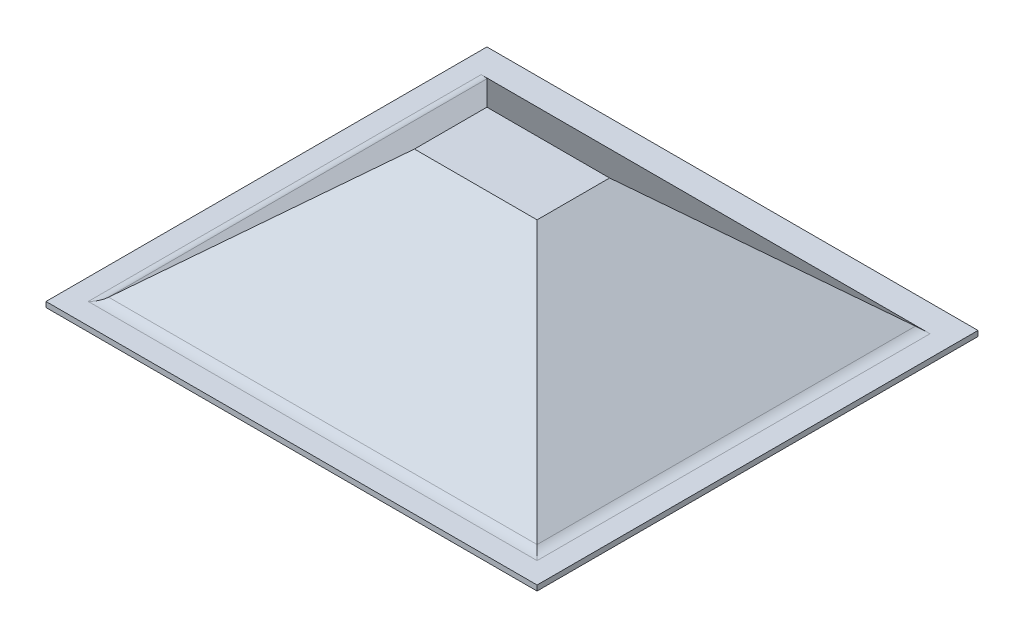
ISO-10303-21;
HEADER;
FILE_DESCRIPTION(('STEP AP214'),'2;1');
FILE_NAME('part.step','',(''),(''),'','','');
FILE_SCHEMA(('AUTOMOTIVE_DESIGN { 1 0 10303 214 1 1 1 1 }'));
ENDSEC;
DATA;
#1=APPLICATION_CONTEXT('core data for automotive mechanical design processes');
#2=APPLICATION_PROTOCOL_DEFINITION('international standard','automotive_design',2000,#1);
#3=PRODUCT_CONTEXT('',#1,'mechanical');
#4=PRODUCT('Part','Part','',(#3));
#5=PRODUCT_RELATED_PRODUCT_CATEGORY('part','',(#4));
#6=PRODUCT_DEFINITION_FORMATION('','',#4);
#7=PRODUCT_DEFINITION_CONTEXT('part definition',#1,'design');
#8=PRODUCT_DEFINITION('design','',#6,#7);
#9=PRODUCT_DEFINITION_SHAPE('','',#8);
#10=(LENGTH_UNIT() NAMED_UNIT(*) SI_UNIT(.MILLI.,.METRE.));
#11=(NAMED_UNIT(*) PLANE_ANGLE_UNIT() SI_UNIT($,.RADIAN.));
#12=(NAMED_UNIT(*) SI_UNIT($,.STERADIAN.) SOLID_ANGLE_UNIT());
#13=UNCERTAINTY_MEASURE_WITH_UNIT(LENGTH_MEASURE(1.E-05),#10,'distance_accuracy_value','');
#14=(GEOMETRIC_REPRESENTATION_CONTEXT(3) GLOBAL_UNCERTAINTY_ASSIGNED_CONTEXT((#13)) GLOBAL_UNIT_ASSIGNED_CONTEXT((#10,
#11,#12)) REPRESENTATION_CONTEXT('',''));
#15=CARTESIAN_POINT('',(0.,0.,0.));
#16=DIRECTION('',(0.,0.,1.));
#17=DIRECTION('',(1.,0.,0.));
#18=AXIS2_PLACEMENT_3D('',#15,#16,#17);
#19=CARTESIAN_POINT('',(-79.,-32.,-79.5));
#20=DIRECTION('',(-1.,0.,0.));
#21=DIRECTION('',(0.,-1.,0.));
#22=AXIS2_PLACEMENT_3D('',#19,#20,#21);
#23=PLANE('',#22);
#24=DIRECTION('',(0.,0.,1.));
#25=VECTOR('',#24,1.);
#26=CARTESIAN_POINT('',(-78.9999999999999,-30.,-84.));
#27=LINE('',#26,#25);
#28=CARTESIAN_POINT('',(-79.,-30.,-79.5));
#29=VERTEX_POINT('',#28);
#30=CARTESIAN_POINT('',(-79.,-30.,79.5));
#31=VERTEX_POINT('',#30);
#32=EDGE_CURVE('E55',#29,#31,#27,.T.);
#33=ORIENTED_EDGE('',*,*,#32,.F.);
#34=DIRECTION('',(0.,-1.,0.));
#35=VECTOR('',#34,1.);
#36=CARTESIAN_POINT('',(-79.,-32.,-79.5));
#37=LINE('',#36,#35);
#38=CARTESIAN_POINT('',(-79.,-32.,-79.5));
#39=VERTEX_POINT('',#38);
#40=EDGE_CURVE('E47',#29,#39,#37,.T.);
#41=ORIENTED_EDGE('',*,*,#40,.T.);
#42=DIRECTION('',(0.,0.,1.));
#43=VECTOR('',#42,1.);
#44=CARTESIAN_POINT('',(-79.,-32.,87.5));
#45=LINE('',#44,#43);
#46=CARTESIAN_POINT('',(-79.,-32.,79.5));
#47=VERTEX_POINT('',#46);
#48=EDGE_CURVE('E42',#39,#47,#45,.T.);
#49=ORIENTED_EDGE('',*,*,#48,.T.);
#50=DIRECTION('',(0.,-1.,0.));
#51=VECTOR('',#50,1.);
#52=CARTESIAN_POINT('',(-79.,-32.,79.5));
#53=LINE('',#52,#51);
#54=EDGE_CURVE('E11',#31,#47,#53,.T.);
#55=ORIENTED_EDGE('',*,*,#54,.F.);
#56=EDGE_LOOP('',(#33,#41,#49,#55));
#57=FACE_BOUND('',#56,.T.);
#58=ADVANCED_FACE('F38',(#57),#23,.T.);
#59=CARTESIAN_POINT('',(99.,-32.,-79.5));
#60=DIRECTION('',(0.,0.,-1.));
#61=DIRECTION('',(-1.,0.,0.));
#62=AXIS2_PLACEMENT_3D('',#59,#60,#61);
#63=PLANE('',#62);
#64=DIRECTION('',(-1.,0.,0.));
#65=VECTOR('',#64,1.);
#66=CARTESIAN_POINT('',(103.5,-30.,-79.5));
#67=LINE('',#66,#65);
#68=CARTESIAN_POINT('',(99.,-30.,-79.5));
#69=VERTEX_POINT('',#68);
#70=EDGE_CURVE('E219',#69,#29,#67,.T.);
#71=ORIENTED_EDGE('',*,*,#70,.F.);
#72=DIRECTION('',(0.,-1.,0.));
#73=VECTOR('',#72,1.);
#74=CARTESIAN_POINT('',(99.,-32.,-79.5));
#75=LINE('',#74,#73);
#76=CARTESIAN_POINT('',(99.,-32.,-79.5));
#77=VERTEX_POINT('',#76);
#78=EDGE_CURVE('E308',#69,#77,#75,.T.);
#79=ORIENTED_EDGE('',*,*,#78,.T.);
#80=DIRECTION('',(-1.,0.,0.));
#81=VECTOR('',#80,1.);
#82=CARTESIAN_POINT('',(-125.,-32.,-79.5));
#83=LINE('',#82,#81);
#84=EDGE_CURVE('E262',#77,#39,#83,.T.);
#85=ORIENTED_EDGE('',*,*,#84,.T.);
#86=ORIENTED_EDGE('',*,*,#40,.F.);
#87=EDGE_LOOP('',(#71,#79,#85,#86));
#88=FACE_BOUND('',#87,.T.);
#89=ADVANCED_FACE('F389',(#88),#63,.T.);
#90=CARTESIAN_POINT('',(-79.,-32.,79.5));
#91=DIRECTION('',(0.,0.,1.));
#92=DIRECTION('',(1.,0.,0.));
#93=AXIS2_PLACEMENT_3D('',#90,#91,#92);
#94=PLANE('',#93);
#95=DIRECTION('',(1.,0.,0.));
#96=VECTOR('',#95,1.);
#97=CARTESIAN_POINT('',(-83.5,-30.,79.5));
#98=LINE('',#97,#96);
#99=CARTESIAN_POINT('',(99.,-30.,79.5));
#100=VERTEX_POINT('',#99);
#101=EDGE_CURVE('E62',#31,#100,#98,.T.);
#102=ORIENTED_EDGE('',*,*,#101,.F.);
#103=ORIENTED_EDGE('',*,*,#54,.T.);
#104=DIRECTION('',(1.,0.,0.));
#105=VECTOR('',#104,1.);
#106=CARTESIAN_POINT('',(-125.,-32.,79.5));
#107=LINE('',#106,#105);
#108=CARTESIAN_POINT('',(99.,-32.,79.5));
#109=VERTEX_POINT('',#108);
#110=EDGE_CURVE('E360',#47,#109,#107,.T.);
#111=ORIENTED_EDGE('',*,*,#110,.T.);
#112=DIRECTION('',(0.,-1.,0.));
#113=VECTOR('',#112,1.);
#114=CARTESIAN_POINT('',(99.,-32.,79.5));
#115=LINE('',#114,#113);
#116=EDGE_CURVE('E353',#100,#109,#115,.T.);
#117=ORIENTED_EDGE('',*,*,#116,.F.);
#118=EDGE_LOOP('',(#102,#103,#111,#117));
#119=FACE_BOUND('',#118,.T.);
#120=ADVANCED_FACE('F371',(#119),#94,.T.);
#121=CARTESIAN_POINT('',(99.,-32.,79.5));
#122=DIRECTION('',(1.,0.,0.));
#123=DIRECTION('',(0.,1.,0.));
#124=AXIS2_PLACEMENT_3D('',#121,#122,#123);
#125=PLANE('',#124);
#126=DIRECTION('',(0.,0.,-1.));
#127=VECTOR('',#126,1.);
#128=CARTESIAN_POINT('',(99.,-30.,84.));
#129=LINE('',#128,#127);
#130=EDGE_CURVE('E211',#100,#69,#129,.T.);
#131=ORIENTED_EDGE('',*,*,#130,.F.);
#132=ORIENTED_EDGE('',*,*,#116,.T.);
#133=DIRECTION('',(0.,0.,-1.));
#134=VECTOR('',#133,1.);
#135=CARTESIAN_POINT('',(99.,-32.,87.5));
#136=LINE('',#135,#134);
#137=EDGE_CURVE('E358',#109,#77,#136,.T.);
#138=ORIENTED_EDGE('',*,*,#137,.T.);
#139=ORIENTED_EDGE('',*,*,#78,.F.);
#140=EDGE_LOOP('',(#131,#132,#138,#139));
#141=FACE_BOUND('',#140,.T.);
#142=ADVANCED_FACE('F369',(#141),#125,.T.);
#143=CARTESIAN_POINT('',(-125.,-32.,87.5));
#144=DIRECTION('',(0.,1.,0.));
#145=DIRECTION('',(-1.,0.,0.));
#146=AXIS2_PLACEMENT_3D('',#143,#144,#145);
#147=PLANE('',#146);
#148=DIRECTION('',(-1.,0.,0.));
#149=VECTOR('',#148,1.);
#150=CARTESIAN_POINT('',(-125.,-32.,75.5));
#151=LINE('',#150,#149);
#152=CARTESIAN_POINT('',(-75.,-32.,75.5));
#153=VERTEX_POINT('',#152);
#154=CARTESIAN_POINT('',(95.,-32.,75.5));
#155=VERTEX_POINT('',#154);
#156=EDGE_CURVE('E272',#153,#155,#151,.F.);
#157=ORIENTED_EDGE('',*,*,#156,.T.);
#158=DIRECTION('',(0.,0.,1.));
#159=VECTOR('',#158,1.);
#160=CARTESIAN_POINT('',(95.,-32.,87.5));
#161=LINE('',#160,#159);
#162=CARTESIAN_POINT('',(95.,-32.,-75.5));
#163=VERTEX_POINT('',#162);
#164=EDGE_CURVE('E269',#155,#163,#161,.F.);
#165=ORIENTED_EDGE('',*,*,#164,.T.);
#166=DIRECTION('',(1.,0.,0.));
#167=VECTOR('',#166,1.);
#168=CARTESIAN_POINT('',(-125.,-32.,-75.5));
#169=LINE('',#168,#167);
#170=CARTESIAN_POINT('',(-75.,-32.,-75.5));
#171=VERTEX_POINT('',#170);
#172=EDGE_CURVE('E276',#163,#171,#169,.F.);
#173=ORIENTED_EDGE('',*,*,#172,.T.);
#174=DIRECTION('',(0.,0.,-1.));
#175=VECTOR('',#174,1.);
#176=CARTESIAN_POINT('',(-75.,-32.,87.5));
#177=LINE('',#176,#175);
#178=EDGE_CURVE('E274',#171,#153,#177,.F.);
#179=ORIENTED_EDGE('',*,*,#178,.T.);
#180=EDGE_LOOP('',(#157,#165,#173,#179));
#181=FACE_BOUND('',#180,.T.);
#182=ORIENTED_EDGE('',*,*,#84,.F.);
#183=ORIENTED_EDGE('',*,*,#137,.F.);
#184=ORIENTED_EDGE('',*,*,#110,.F.);
#185=ORIENTED_EDGE('',*,*,#48,.F.);
#186=EDGE_LOOP('',(#182,#183,#184,#185));
#187=FACE_BOUND('',#186,.T.);
#188=ADVANCED_FACE('F40',(#181,#187),#147,.F.);
#189=CARTESIAN_POINT('',(-68.5721239031346,-29.6604444311898,-75.5));
#190=DIRECTION('',(-0.642787609686538,0.766044443118979,0.));
#191=DIRECTION('',(-0.766044443118979,-0.642787609686538,0.));
#192=AXIS2_PLACEMENT_3D('',#189,#190,#191);
#193=PLANE('',#192);
#194=DIRECTION('',(-0.608120402411343,-0.510273605374736,0.608120402411343));
#195=VECTOR('',#194,1.);
#196=CARTESIAN_POINT('',(-70.9492194868363,-31.655064458747,71.4492194868363));
#197=LINE('',#196,#195);
#198=CARTESIAN_POINT('',(-11.7726180276272,18.,12.2726180276273));
#199=VERTEX_POINT('',#198);
#200=CARTESIAN_POINT('',(-68.5721239031346,-29.6604444311898,69.0721239031346));
#201=VERTEX_POINT('',#200);
#202=EDGE_CURVE('E278',#199,#201,#197,.T.);
#203=ORIENTED_EDGE('',*,*,#202,.T.);
#204=DIRECTION('',(0.,0.,-1.));
#205=VECTOR('',#204,1.);
#206=CARTESIAN_POINT('',(-68.5721239031346,-29.6604444311898,-75.5));
#207=LINE('',#206,#205);
#208=CARTESIAN_POINT('',(-68.5721239031346,-29.6604444311898,-69.0721239031346));
#209=VERTEX_POINT('',#208);
#210=EDGE_CURVE('E261',#201,#209,#207,.T.);
#211=ORIENTED_EDGE('',*,*,#210,.T.);
#212=DIRECTION('',(-0.608120402411343,-0.510273605374736,-0.608120402411344));
#213=VECTOR('',#212,1.);
#214=CARTESIAN_POINT('',(-70.9492194868363,-31.655064458747,-71.4492194868363));
#215=LINE('',#214,#213);
#216=CARTESIAN_POINT('',(-11.7726180276272,18.,-12.2726180276273));
#217=VERTEX_POINT('',#216);
#218=EDGE_CURVE('E286',#217,#209,#215,.T.);
#219=ORIENTED_EDGE('',*,*,#218,.F.);
#220=DIRECTION('',(0.,0.,-1.));
#221=VECTOR('',#220,1.);
#222=CARTESIAN_POINT('',(-11.7726180276272,18.,-75.5));
#223=LINE('',#222,#221);
#224=EDGE_CURVE('E251',#199,#217,#223,.T.);
#225=ORIENTED_EDGE('',*,*,#224,.F.);
#226=EDGE_LOOP('',(#203,#211,#219,#225));
#227=FACE_BOUND('',#226,.T.);
#228=ADVANCED_FACE('F407',(#227),#193,.F.);
#229=CARTESIAN_POINT('',(-75.,-29.6604444311898,69.0721239031346));
#230=DIRECTION('',(0.,0.766044443118979,0.642787609686538));
#231=DIRECTION('',(0.,-0.642787609686538,0.766044443118979));
#232=AXIS2_PLACEMENT_3D('',#229,#230,#231);
#233=PLANE('',#232);
#234=DIRECTION('',(0.608120402411344,-0.510273605374735,0.608120402411343));
#235=VECTOR('',#234,1.);
#236=CARTESIAN_POINT('',(90.9492194868363,-31.655064458747,71.4492194868363));
#237=LINE('',#236,#235);
#238=CARTESIAN_POINT('',(31.7726180276273,18.,12.2726180276273));
#239=VERTEX_POINT('',#238);
#240=CARTESIAN_POINT('',(88.5721239031347,-29.6604444311898,69.0721239031346));
#241=VERTEX_POINT('',#240);
#242=EDGE_CURVE('E287',#239,#241,#237,.T.);
#243=ORIENTED_EDGE('',*,*,#242,.T.);
#244=DIRECTION('',(-1.,0.,0.));
#245=VECTOR('',#244,1.);
#246=CARTESIAN_POINT('',(-75.,-29.6604444311898,69.0721239031346));
#247=LINE('',#246,#245);
#248=EDGE_CURVE('E264',#241,#201,#247,.T.);
#249=ORIENTED_EDGE('',*,*,#248,.T.);
#250=ORIENTED_EDGE('',*,*,#202,.F.);
#251=DIRECTION('',(-1.,0.,0.));
#252=VECTOR('',#251,1.);
#253=CARTESIAN_POINT('',(-75.,18.,12.2726180276273));
#254=LINE('',#253,#252);
#255=EDGE_CURVE('E290',#239,#199,#254,.T.);
#256=ORIENTED_EDGE('',*,*,#255,.F.);
#257=EDGE_LOOP('',(#243,#249,#250,#256));
#258=FACE_BOUND('',#257,.T.);
#259=ADVANCED_FACE('F412',(#258),#233,.F.);
#260=CARTESIAN_POINT('',(88.5721239031347,-29.6604444311898,75.5));
#261=DIRECTION('',(0.642787609686538,0.766044443118979,0.));
#262=DIRECTION('',(-0.766044443118979,0.642787609686538,0.));
#263=AXIS2_PLACEMENT_3D('',#260,#261,#262);
#264=PLANE('',#263);
#265=DIRECTION('',(0.608120402411344,-0.510273605374735,-0.608120402411343));
#266=VECTOR('',#265,1.);
#267=CARTESIAN_POINT('',(28.0814474359175,21.0972598821161,-8.58144743591743));
#268=LINE('',#267,#266);
#269=CARTESIAN_POINT('',(31.7726180276273,18.,-12.2726180276273));
#270=VERTEX_POINT('',#269);
#271=CARTESIAN_POINT('',(88.5721239031347,-29.6604444311898,-69.0721239031346));
#272=VERTEX_POINT('',#271);
#273=EDGE_CURVE('E283',#270,#272,#268,.T.);
#274=ORIENTED_EDGE('',*,*,#273,.T.);
#275=DIRECTION('',(0.,0.,1.));
#276=VECTOR('',#275,1.);
#277=CARTESIAN_POINT('',(88.5721239031347,-29.6604444311898,75.5));
#278=LINE('',#277,#276);
#279=EDGE_CURVE('E266',#272,#241,#278,.T.);
#280=ORIENTED_EDGE('',*,*,#279,.T.);
#281=ORIENTED_EDGE('',*,*,#242,.F.);
#282=DIRECTION('',(0.,0.,1.));
#283=VECTOR('',#282,1.);
#284=CARTESIAN_POINT('',(31.7726180276273,18.,75.5));
#285=LINE('',#284,#283);
#286=EDGE_CURVE('E282',#270,#239,#285,.T.);
#287=ORIENTED_EDGE('',*,*,#286,.F.);
#288=EDGE_LOOP('',(#274,#280,#281,#287));
#289=FACE_BOUND('',#288,.T.);
#290=ADVANCED_FACE('F427',(#289),#264,.F.);
#291=CARTESIAN_POINT('',(-75.,-29.6604444311898,-69.0721239031346));
#292=DIRECTION('',(0.,0.766044443118979,-0.642787609686538));
#293=DIRECTION('',(0.,0.642787609686538,0.766044443118979));
#294=AXIS2_PLACEMENT_3D('',#291,#292,#293);
#295=PLANE('',#294);
#296=ORIENTED_EDGE('',*,*,#218,.T.);
#297=DIRECTION('',(1.,0.,0.));
#298=VECTOR('',#297,1.);
#299=CARTESIAN_POINT('',(-75.,-29.6604444311898,-69.0721239031346));
#300=LINE('',#299,#298);
#301=EDGE_CURVE('E259',#209,#272,#300,.T.);
#302=ORIENTED_EDGE('',*,*,#301,.T.);
#303=ORIENTED_EDGE('',*,*,#273,.F.);
#304=DIRECTION('',(1.,0.,0.));
#305=VECTOR('',#304,1.);
#306=CARTESIAN_POINT('',(-75.,18.,-12.2726180276273));
#307=LINE('',#306,#305);
#308=EDGE_CURVE('E279',#217,#270,#307,.T.);
#309=ORIENTED_EDGE('',*,*,#308,.F.);
#310=EDGE_LOOP('',(#296,#302,#303,#309));
#311=FACE_BOUND('',#310,.T.);
#312=ADVANCED_FACE('F435',(#311),#295,.F.);
#313=CARTESIAN_POINT('',(0.,18.,0.));
#314=DIRECTION('',(0.,1.,0.));
#315=DIRECTION('',(-1.,0.,0.));
#316=AXIS2_PLACEMENT_3D('',#313,#314,#315);
#317=PLANE('',#316);
#318=ORIENTED_EDGE('',*,*,#224,.T.);
#319=ORIENTED_EDGE('',*,*,#308,.T.);
#320=ORIENTED_EDGE('',*,*,#286,.T.);
#321=ORIENTED_EDGE('',*,*,#255,.T.);
#322=EDGE_LOOP('',(#318,#319,#320,#321));
#323=FACE_BOUND('',#322,.T.);
#324=ADVANCED_FACE('F432',(#323),#317,.F.);
#325=CARTESIAN_POINT('',(-75.,-22.,-75.5));
#326=DIRECTION('',(0.,0.,-1.));
#327=DIRECTION('',(-1.,0.,0.));
#328=AXIS2_PLACEMENT_3D('',#325,#326,#327);
#329=CYLINDRICAL_SURFACE('',#328,10.);
#330=CARTESIAN_POINT('',(-75.,-22.,75.5));
#331=DIRECTION('',(-0.707106781186548,0.,-0.707106781186547));
#332=DIRECTION('',(-0.707106781186547,0.,0.707106781186547));
#333=AXIS2_PLACEMENT_3D('',#330,#331,#332);
#334=ELLIPSE('',#333,14.142135623731,10.);
#335=EDGE_CURVE('E250',#153,#201,#334,.F.);
#336=ORIENTED_EDGE('',*,*,#335,.F.);
#337=ORIENTED_EDGE('',*,*,#178,.F.);
#338=CARTESIAN_POINT('',(-75.,-22.,-75.5));
#339=DIRECTION('',(0.707106781186548,0.,-0.707106781186547));
#340=DIRECTION('',(-0.707106781186547,0.,-0.707106781186547));
#341=AXIS2_PLACEMENT_3D('',#338,#339,#340);
#342=ELLIPSE('',#341,14.142135623731,10.);
#343=EDGE_CURVE('E247',#209,#171,#342,.T.);
#344=ORIENTED_EDGE('',*,*,#343,.F.);
#345=ORIENTED_EDGE('',*,*,#210,.F.);
#346=EDGE_LOOP('',(#336,#337,#344,#345));
#347=FACE_BOUND('',#346,.T.);
#348=ADVANCED_FACE('F441',(#347),#329,.T.);
#349=CARTESIAN_POINT('',(-75.,-22.,-75.5));
#350=DIRECTION('',(1.,0.,0.));
#351=DIRECTION('',(0.,1.,0.));
#352=AXIS2_PLACEMENT_3D('',#349,#350,#351);
#353=CYLINDRICAL_SURFACE('',#352,10.);
#354=ORIENTED_EDGE('',*,*,#343,.T.);
#355=ORIENTED_EDGE('',*,*,#172,.F.);
#356=CARTESIAN_POINT('',(95.,-22.,-75.5));
#357=DIRECTION('',(0.707106781186547,0.,0.707106781186547));
#358=DIRECTION('',(-0.707106781186548,0.,0.707106781186547));
#359=AXIS2_PLACEMENT_3D('',#356,#357,#358);
#360=ELLIPSE('',#359,14.1421356237309,10.);
#361=EDGE_CURVE('E254',#272,#163,#360,.T.);
#362=ORIENTED_EDGE('',*,*,#361,.F.);
#363=ORIENTED_EDGE('',*,*,#301,.F.);
#364=EDGE_LOOP('',(#354,#355,#362,#363));
#365=FACE_BOUND('',#364,.T.);
#366=ADVANCED_FACE('F439',(#365),#353,.T.);
#367=CARTESIAN_POINT('',(-75.,-22.,75.5));
#368=DIRECTION('',(-1.,0.,0.));
#369=DIRECTION('',(0.,-1.,0.));
#370=AXIS2_PLACEMENT_3D('',#367,#368,#369);
#371=CYLINDRICAL_SURFACE('',#370,10.);
#372=ORIENTED_EDGE('',*,*,#335,.T.);
#373=ORIENTED_EDGE('',*,*,#248,.F.);
#374=CARTESIAN_POINT('',(95.,-22.,75.5));
#375=DIRECTION('',(-0.707106781186547,0.,0.707106781186547));
#376=DIRECTION('',(0.707106781186548,0.,0.707106781186547));
#377=AXIS2_PLACEMENT_3D('',#374,#375,#376);
#378=ELLIPSE('',#377,14.1421356237309,10.);
#379=EDGE_CURVE('E256',#155,#241,#378,.F.);
#380=ORIENTED_EDGE('',*,*,#379,.F.);
#381=ORIENTED_EDGE('',*,*,#156,.F.);
#382=EDGE_LOOP('',(#372,#373,#380,#381));
#383=FACE_BOUND('',#382,.T.);
#384=ADVANCED_FACE('F403',(#383),#371,.T.);
#385=CARTESIAN_POINT('',(95.,-22.,75.5));
#386=DIRECTION('',(0.,0.,1.));
#387=DIRECTION('',(1.,0.,0.));
#388=AXIS2_PLACEMENT_3D('',#385,#386,#387);
#389=CYLINDRICAL_SURFACE('',#388,10.);
#390=ORIENTED_EDGE('',*,*,#361,.T.);
#391=ORIENTED_EDGE('',*,*,#164,.F.);
#392=ORIENTED_EDGE('',*,*,#379,.T.);
#393=ORIENTED_EDGE('',*,*,#279,.F.);
#394=EDGE_LOOP('',(#390,#391,#392,#393));
#395=FACE_BOUND('',#394,.T.);
#396=ADVANCED_FACE('F392',(#395),#389,.T.);
#397=CARTESIAN_POINT('',(-82.9999999999999,-28.,-84.));
#398=DIRECTION('',(1.,0.,0.));
#399=DIRECTION('',(0.,1.,0.));
#400=AXIS2_PLACEMENT_3D('',#397,#398,#399);
#401=PLANE('',#400);
#402=DIRECTION('',(0.,0.,1.));
#403=VECTOR('',#402,1.);
#404=CARTESIAN_POINT('',(-82.9999999999999,-28.,-84.));
#405=LINE('',#404,#403);
#406=CARTESIAN_POINT('',(-83.,-28.,-83.5));
#407=VERTEX_POINT('',#406);
#408=CARTESIAN_POINT('',(-83.,-28.,83.5));
#409=VERTEX_POINT('',#408);
#410=EDGE_CURVE('E240',#407,#409,#405,.T.);
#411=ORIENTED_EDGE('',*,*,#410,.F.);
#412=DIRECTION('',(0.,-1.,0.));
#413=VECTOR('',#412,1.);
#414=CARTESIAN_POINT('',(-83.,-28.,-83.5));
#415=LINE('',#414,#413);
#416=CARTESIAN_POINT('',(-82.9999999999999,-30.,-83.5));
#417=VERTEX_POINT('',#416);
#418=EDGE_CURVE('E201',#407,#417,#415,.T.);
#419=ORIENTED_EDGE('',*,*,#418,.T.);
#420=DIRECTION('',(0.,0.,1.));
#421=VECTOR('',#420,1.);
#422=CARTESIAN_POINT('',(-82.9999999999999,-30.,-84.));
#423=LINE('',#422,#421);
#424=CARTESIAN_POINT('',(-83.,-30.,83.5));
#425=VERTEX_POINT('',#424);
#426=EDGE_CURVE('E243',#417,#425,#423,.T.);
#427=ORIENTED_EDGE('',*,*,#426,.T.);
#428=DIRECTION('',(0.,-1.,0.));
#429=VECTOR('',#428,1.);
#430=CARTESIAN_POINT('',(-83.,-28.,83.5));
#431=LINE('',#430,#429);
#432=EDGE_CURVE('E231',#409,#425,#431,.T.);
#433=ORIENTED_EDGE('',*,*,#432,.F.);
#434=EDGE_LOOP('',(#411,#419,#427,#433));
#435=FACE_BOUND('',#434,.T.);
#436=ADVANCED_FACE('F402',(#435),#401,.F.);
#437=CARTESIAN_POINT('',(-82.9999999999999,-30.,-84.));
#438=DIRECTION('',(0.,1.,0.));
#439=DIRECTION('',(-1.,0.,0.));
#440=AXIS2_PLACEMENT_3D('',#437,#438,#439);
#441=PLANE('',#440);
#442=ORIENTED_EDGE('',*,*,#426,.F.);
#443=DIRECTION('',(0.707106781186548,0.,0.707106781186548));
#444=VECTOR('',#443,1.);
#445=CARTESIAN_POINT('',(10.2500000000001,-30.,9.75000000000001));
#446=LINE('',#445,#444);
#447=EDGE_CURVE('E195',#417,#29,#446,.T.);
#448=ORIENTED_EDGE('',*,*,#447,.T.);
#449=ORIENTED_EDGE('',*,*,#32,.T.);
#450=DIRECTION('',(0.707106781186548,0.,-0.707106781186548));
#451=VECTOR('',#450,1.);
#452=CARTESIAN_POINT('',(-83.25,-30.,83.75));
#453=LINE('',#452,#451);
#454=EDGE_CURVE('E228',#425,#31,#453,.T.);
#455=ORIENTED_EDGE('',*,*,#454,.F.);
#456=EDGE_LOOP('',(#442,#448,#449,#455));
#457=FACE_BOUND('',#456,.T.);
#458=ADVANCED_FACE('F382',(#457),#441,.F.);
#459=CARTESIAN_POINT('',(-83.5,-28.,83.5));
#460=DIRECTION('',(0.,0.,-1.));
#461=DIRECTION('',(0.,1.,0.));
#462=AXIS2_PLACEMENT_3D('',#459,#460,#461);
#463=PLANE('',#462);
#464=DIRECTION('',(1.,0.,0.));
#465=VECTOR('',#464,1.);
#466=CARTESIAN_POINT('',(-83.5,-28.,83.5));
#467=LINE('',#466,#465);
#468=CARTESIAN_POINT('',(103.,-28.,83.5));
#469=VERTEX_POINT('',#468);
#470=EDGE_CURVE('E192',#409,#469,#467,.T.);
#471=ORIENTED_EDGE('',*,*,#470,.F.);
#472=ORIENTED_EDGE('',*,*,#432,.T.);
#473=DIRECTION('',(1.,0.,0.));
#474=VECTOR('',#473,1.);
#475=CARTESIAN_POINT('',(-83.5,-30.,83.5));
#476=LINE('',#475,#474);
#477=CARTESIAN_POINT('',(103.,-30.,83.5));
#478=VERTEX_POINT('',#477);
#479=EDGE_CURVE('E236',#425,#478,#476,.T.);
#480=ORIENTED_EDGE('',*,*,#479,.T.);
#481=DIRECTION('',(0.,-1.,0.));
#482=VECTOR('',#481,1.);
#483=CARTESIAN_POINT('',(103.,-28.,83.5));
#484=LINE('',#483,#482);
#485=EDGE_CURVE('E198',#469,#478,#484,.T.);
#486=ORIENTED_EDGE('',*,*,#485,.F.);
#487=EDGE_LOOP('',(#471,#472,#480,#486));
#488=FACE_BOUND('',#487,.T.);
#489=ADVANCED_FACE('F611',(#488),#463,.F.);
#490=CARTESIAN_POINT('',(-83.5,-30.,83.5));
#491=DIRECTION('',(0.,1.,0.));
#492=DIRECTION('',(0.,0.,1.));
#493=AXIS2_PLACEMENT_3D('',#490,#491,#492);
#494=PLANE('',#493);
#495=ORIENTED_EDGE('',*,*,#479,.F.);
#496=ORIENTED_EDGE('',*,*,#454,.T.);
#497=ORIENTED_EDGE('',*,*,#101,.T.);
#498=DIRECTION('',(-0.707106781186548,0.,-0.707106781186548));
#499=VECTOR('',#498,1.);
#500=CARTESIAN_POINT('',(103.25,-30.,83.75));
#501=LINE('',#500,#499);
#502=EDGE_CURVE('E194',#478,#100,#501,.T.);
#503=ORIENTED_EDGE('',*,*,#502,.F.);
#504=EDGE_LOOP('',(#495,#496,#497,#503));
#505=FACE_BOUND('',#504,.T.);
#506=ADVANCED_FACE('F378',(#505),#494,.F.);
#507=CARTESIAN_POINT('',(103.5,-28.,-83.5));
#508=DIRECTION('',(0.,0.,1.));
#509=DIRECTION('',(0.,-1.,0.));
#510=AXIS2_PLACEMENT_3D('',#507,#508,#509);
#511=PLANE('',#510);
#512=DIRECTION('',(-1.,0.,0.));
#513=VECTOR('',#512,1.);
#514=CARTESIAN_POINT('',(103.5,-28.,-83.5));
#515=LINE('',#514,#513);
#516=CARTESIAN_POINT('',(103.,-28.,-83.5));
#517=VERTEX_POINT('',#516);
#518=EDGE_CURVE('E220',#517,#407,#515,.T.);
#519=ORIENTED_EDGE('',*,*,#518,.F.);
#520=DIRECTION('',(0.,-1.,0.));
#521=VECTOR('',#520,1.);
#522=CARTESIAN_POINT('',(103.,-28.,-83.5));
#523=LINE('',#522,#521);
#524=CARTESIAN_POINT('',(103.,-30.,-83.5));
#525=VERTEX_POINT('',#524);
#526=EDGE_CURVE('E797',#517,#525,#523,.T.);
#527=ORIENTED_EDGE('',*,*,#526,.T.);
#528=DIRECTION('',(-1.,0.,0.));
#529=VECTOR('',#528,1.);
#530=CARTESIAN_POINT('',(103.5,-30.,-83.5));
#531=LINE('',#530,#529);
#532=EDGE_CURVE('E223',#525,#417,#531,.T.);
#533=ORIENTED_EDGE('',*,*,#532,.T.);
#534=ORIENTED_EDGE('',*,*,#418,.F.);
#535=EDGE_LOOP('',(#519,#527,#533,#534));
#536=FACE_BOUND('',#535,.T.);
#537=ADVANCED_FACE('F591',(#536),#511,.F.);
#538=CARTESIAN_POINT('',(103.5,-30.,-83.5));
#539=DIRECTION('',(0.,1.,0.));
#540=DIRECTION('',(-1.,0.,0.));
#541=AXIS2_PLACEMENT_3D('',#538,#539,#540);
#542=PLANE('',#541);
#543=ORIENTED_EDGE('',*,*,#532,.F.);
#544=DIRECTION('',(-0.707106781186548,0.,0.707106781186548));
#545=VECTOR('',#544,1.);
#546=CARTESIAN_POINT('',(19.2500000000001,-30.,0.250000000000028));
#547=LINE('',#546,#545);
#548=EDGE_CURVE('E387',#525,#69,#547,.T.);
#549=ORIENTED_EDGE('',*,*,#548,.T.);
#550=ORIENTED_EDGE('',*,*,#70,.T.);
#551=ORIENTED_EDGE('',*,*,#447,.F.);
#552=EDGE_LOOP('',(#543,#549,#550,#551));
#553=FACE_BOUND('',#552,.T.);
#554=ADVANCED_FACE('F386',(#553),#542,.F.);
#555=CARTESIAN_POINT('',(103.,-28.,84.));
#556=DIRECTION('',(-1.,0.,0.));
#557=DIRECTION('',(0.,0.,1.));
#558=AXIS2_PLACEMENT_3D('',#555,#556,#557);
#559=PLANE('',#558);
#560=ORIENTED_EDGE('',*,*,#485,.T.);
#561=DIRECTION('',(0.,0.,-1.));
#562=VECTOR('',#561,1.);
#563=CARTESIAN_POINT('',(103.,-30.,84.));
#564=LINE('',#563,#562);
#565=EDGE_CURVE('E207',#478,#525,#564,.T.);
#566=ORIENTED_EDGE('',*,*,#565,.T.);
#567=ORIENTED_EDGE('',*,*,#526,.F.);
#568=DIRECTION('',(0.,0.,-1.));
#569=VECTOR('',#568,1.);
#570=CARTESIAN_POINT('',(103.,-28.,84.));
#571=LINE('',#570,#569);
#572=EDGE_CURVE('E205',#469,#517,#571,.T.);
#573=ORIENTED_EDGE('',*,*,#572,.F.);
#574=EDGE_LOOP('',(#560,#566,#567,#573));
#575=FACE_BOUND('',#574,.T.);
#576=ADVANCED_FACE('F571',(#575),#559,.F.);
#577=CARTESIAN_POINT('',(103.,-30.,84.));
#578=DIRECTION('',(0.,1.,0.));
#579=DIRECTION('',(0.,0.,1.));
#580=AXIS2_PLACEMENT_3D('',#577,#578,#579);
#581=PLANE('',#580);
#582=ORIENTED_EDGE('',*,*,#502,.T.);
#583=ORIENTED_EDGE('',*,*,#130,.T.);
#584=ORIENTED_EDGE('',*,*,#548,.F.);
#585=ORIENTED_EDGE('',*,*,#565,.F.);
#586=EDGE_LOOP('',(#582,#583,#584,#585));
#587=FACE_BOUND('',#586,.T.);
#588=ADVANCED_FACE('F375',(#587),#581,.F.);
#589=CARTESIAN_POINT('',(-75.,-26.5962666587139,71.6432743418808));
#590=DIRECTION('',(0.,0.766044443118979,0.642787609686538));
#591=DIRECTION('',(0.,-0.642787609686538,0.766044443118979));
#592=AXIS2_PLACEMENT_3D('',#589,#590,#591);
#593=PLANE('',#592);
#594=DIRECTION('',(0.608120402411344,-0.510273605374735,0.608120402411343));
#595=VECTOR('',#594,1.);
#596=CARTESIAN_POINT('',(92.5695316921018,-27.7930386752482,73.0695316921017));
#597=LINE('',#596,#595);
#598=CARTESIAN_POINT('',(33.2284989646921,22.,13.7284989646921));
#599=VERTEX_POINT('',#598);
#600=CARTESIAN_POINT('',(91.1432743418808,-26.5962666587138,71.6432743418807));
#601=VERTEX_POINT('',#600);
#602=EDGE_CURVE('E337',#599,#601,#597,.T.);
#603=ORIENTED_EDGE('',*,*,#602,.F.);
#604=DIRECTION('',(-1.,0.,0.));
#605=VECTOR('',#604,1.);
#606=CARTESIAN_POINT('',(-75.,22.,13.7284989646921));
#607=LINE('',#606,#605);
#608=CARTESIAN_POINT('',(-13.228498964692,22.,13.7284989646921));
#609=VERTEX_POINT('',#608);
#610=EDGE_CURVE('E340',#599,#609,#607,.T.);
#611=ORIENTED_EDGE('',*,*,#610,.T.);
#612=DIRECTION('',(-0.608120402411343,-0.510273605374736,0.608120402411343));
#613=VECTOR('',#612,1.);
#614=CARTESIAN_POINT('',(-72.5695316921017,-27.7930386752482,73.0695316921018));
#615=LINE('',#614,#613);
#616=CARTESIAN_POINT('',(-71.1432743418808,-26.5962666587139,71.6432743418808));
#617=VERTEX_POINT('',#616);
#618=EDGE_CURVE('E327',#609,#617,#615,.T.);
#619=ORIENTED_EDGE('',*,*,#618,.T.);
#620=DIRECTION('',(-1.,0.,0.));
#621=VECTOR('',#620,1.);
#622=CARTESIAN_POINT('',(-75.,-26.5962666587139,71.6432743418808));
#623=LINE('',#622,#621);
#624=EDGE_CURVE('E315',#601,#617,#623,.T.);
#625=ORIENTED_EDGE('',*,*,#624,.F.);
#626=EDGE_LOOP('',(#603,#611,#619,#625));
#627=FACE_BOUND('',#626,.T.);
#628=ADVANCED_FACE('F486',(#627),#593,.T.);
#629=CARTESIAN_POINT('',(91.1432743418808,-26.5962666587139,75.5));
#630=DIRECTION('',(0.642787609686538,0.766044443118979,0.));
#631=DIRECTION('',(-0.766044443118979,0.642787609686538,0.));
#632=AXIS2_PLACEMENT_3D('',#629,#630,#631);
#633=PLANE('',#632);
#634=DIRECTION('',(0.608120402411344,-0.510273605374735,-0.608120402411343));
#635=VECTOR('',#634,1.);
#636=CARTESIAN_POINT('',(29.7017596411829,24.9592856656149,-10.2017596411829));
#637=LINE('',#636,#635);
#638=CARTESIAN_POINT('',(33.2284989646921,22.,-13.728498964692));
#639=VERTEX_POINT('',#638);
#640=CARTESIAN_POINT('',(91.1432743418808,-26.5962666587139,-71.6432743418808));
#641=VERTEX_POINT('',#640);
#642=EDGE_CURVE('E333',#639,#641,#637,.T.);
#643=ORIENTED_EDGE('',*,*,#642,.F.);
#644=DIRECTION('',(0.,0.,1.));
#645=VECTOR('',#644,1.);
#646=CARTESIAN_POINT('',(33.2284989646921,22.,75.5));
#647=LINE('',#646,#645);
#648=EDGE_CURVE('E332',#639,#599,#647,.T.);
#649=ORIENTED_EDGE('',*,*,#648,.T.);
#650=ORIENTED_EDGE('',*,*,#602,.T.);
#651=DIRECTION('',(0.,0.,1.));
#652=VECTOR('',#651,1.);
#653=CARTESIAN_POINT('',(91.1432743418808,-26.5962666587139,75.5));
#654=LINE('',#653,#652);
#655=EDGE_CURVE('E313',#641,#601,#654,.T.);
#656=ORIENTED_EDGE('',*,*,#655,.F.);
#657=EDGE_LOOP('',(#643,#649,#650,#656));
#658=FACE_BOUND('',#657,.T.);
#659=ADVANCED_FACE('F479',(#658),#633,.T.);
#660=CARTESIAN_POINT('',(0.,22.,0.));
#661=DIRECTION('',(0.,1.,0.));
#662=DIRECTION('',(-1.,0.,0.));
#663=AXIS2_PLACEMENT_3D('',#660,#661,#662);
#664=PLANE('',#663);
#665=DIRECTION('',(0.,0.,-1.));
#666=VECTOR('',#665,1.);
#667=CARTESIAN_POINT('',(-13.228498964692,22.,-75.5));
#668=LINE('',#667,#666);
#669=CARTESIAN_POINT('',(-13.228498964692,22.,-13.7284989646921));
#670=VERTEX_POINT('',#669);
#671=EDGE_CURVE('E331',#609,#670,#668,.T.);
#672=ORIENTED_EDGE('',*,*,#671,.F.);
#673=ORIENTED_EDGE('',*,*,#610,.F.);
#674=ORIENTED_EDGE('',*,*,#648,.F.);
#675=DIRECTION('',(1.,0.,0.));
#676=VECTOR('',#675,1.);
#677=CARTESIAN_POINT('',(-75.,22.,-13.7284989646921));
#678=LINE('',#677,#676);
#679=EDGE_CURVE('E328',#670,#639,#678,.T.);
#680=ORIENTED_EDGE('',*,*,#679,.F.);
#681=EDGE_LOOP('',(#672,#673,#674,#680));
#682=FACE_BOUND('',#681,.T.);
#683=ADVANCED_FACE('F476',(#682),#664,.T.);
#684=CARTESIAN_POINT('',(-71.1432743418807,-26.5962666587139,-75.5));
#685=DIRECTION('',(-0.642787609686538,0.766044443118979,0.));
#686=DIRECTION('',(-0.766044443118979,-0.642787609686538,0.));
#687=AXIS2_PLACEMENT_3D('',#684,#685,#686);
#688=PLANE('',#687);
#689=ORIENTED_EDGE('',*,*,#618,.F.);
#690=ORIENTED_EDGE('',*,*,#671,.T.);
#691=DIRECTION('',(-0.608120402411343,-0.510273605374736,-0.608120402411344));
#692=VECTOR('',#691,1.);
#693=CARTESIAN_POINT('',(-72.5695316921017,-27.7930386752482,-73.0695316921018));
#694=LINE('',#693,#692);
#695=CARTESIAN_POINT('',(-71.1432743418807,-26.5962666587139,-71.6432743418808));
#696=VERTEX_POINT('',#695);
#697=EDGE_CURVE('E336',#670,#696,#694,.T.);
#698=ORIENTED_EDGE('',*,*,#697,.T.);
#699=DIRECTION('',(0.,0.,-1.));
#700=VECTOR('',#699,1.);
#701=CARTESIAN_POINT('',(-71.1432743418807,-26.5962666587139,-75.5));
#702=LINE('',#701,#700);
#703=EDGE_CURVE('E317',#617,#696,#702,.T.);
#704=ORIENTED_EDGE('',*,*,#703,.F.);
#705=EDGE_LOOP('',(#689,#690,#698,#704));
#706=FACE_BOUND('',#705,.T.);
#707=ADVANCED_FACE('F474',(#706),#688,.T.);
#708=CARTESIAN_POINT('',(-75.,-22.,-75.5));
#709=DIRECTION('',(0.,0.,-1.));
#710=DIRECTION('',(-1.,0.,0.));
#711=AXIS2_PLACEMENT_3D('',#708,#709,#710);
#712=CYLINDRICAL_SURFACE('',#711,6.);
#713=CARTESIAN_POINT('',(-75.,-22.,75.5));
#714=DIRECTION('',(-0.707106781186548,0.,-0.707106781186547));
#715=DIRECTION('',(0.707106781186547,0.,-0.707106781186547));
#716=AXIS2_PLACEMENT_3D('',#713,#714,#715);
#717=ELLIPSE('',#716,8.48528137423857,6.);
#718=CARTESIAN_POINT('',(-75.,-28.,75.5));
#719=VERTEX_POINT('',#718);
#720=EDGE_CURVE('E304',#617,#719,#717,.T.);
#721=ORIENTED_EDGE('',*,*,#720,.F.);
#722=ORIENTED_EDGE('',*,*,#703,.T.);
#723=CARTESIAN_POINT('',(-75.,-22.,-66.1656570388375));
#724=DIRECTION('',(0.,0.766044443118979,-0.642787609686538));
#725=DIRECTION('',(0.,-0.642787609686538,-0.766044443118979));
#726=AXIS2_PLACEMENT_3D('',#723,#724,#725);
#727=ELLIPSE('',#726,9.33434296116249,6.);
#728=CARTESIAN_POINT('',(-75.,-28.,-73.3161785944028));
#729=VERTEX_POINT('',#728);
#730=EDGE_CURVE('E310',#696,#729,#727,.T.);
#731=ORIENTED_EDGE('',*,*,#730,.T.);
#732=DIRECTION('',(0.,0.,-1.));
#733=VECTOR('',#732,1.);
#734=CARTESIAN_POINT('',(-75.,-28.,87.5));
#735=LINE('',#734,#733);
#736=EDGE_CURVE('E320',#729,#719,#735,.F.);
#737=ORIENTED_EDGE('',*,*,#736,.T.);
#738=EDGE_LOOP('',(#721,#722,#731,#737));
#739=FACE_BOUND('',#738,.T.);
#740=ADVANCED_FACE('F470',(#739),#712,.F.);
#741=CARTESIAN_POINT('',(-75.,-22.,75.5));
#742=DIRECTION('',(-1.,0.,0.));
#743=DIRECTION('',(0.,-1.,0.));
#744=AXIS2_PLACEMENT_3D('',#741,#742,#743);
#745=CYLINDRICAL_SURFACE('',#744,6.);
#746=CARTESIAN_POINT('',(95.,-22.,75.5));
#747=DIRECTION('',(-0.707106781186547,0.,0.707106781186547));
#748=DIRECTION('',(-0.707106781186548,0.,-0.707106781186547));
#749=AXIS2_PLACEMENT_3D('',#746,#747,#748);
#750=ELLIPSE('',#749,8.48528137423857,6.);
#751=CARTESIAN_POINT('',(95.,-28.,75.5));
#752=VERTEX_POINT('',#751);
#753=EDGE_CURVE('E301',#601,#752,#750,.T.);
#754=ORIENTED_EDGE('',*,*,#753,.F.);
#755=ORIENTED_EDGE('',*,*,#624,.T.);
#756=ORIENTED_EDGE('',*,*,#720,.T.);
#757=DIRECTION('',(-1.,0.,0.));
#758=VECTOR('',#757,1.);
#759=CARTESIAN_POINT('',(-125.,-28.,75.5));
#760=LINE('',#759,#758);
#761=EDGE_CURVE('E322',#719,#752,#760,.F.);
#762=ORIENTED_EDGE('',*,*,#761,.T.);
#763=EDGE_LOOP('',(#754,#755,#756,#762));
#764=FACE_BOUND('',#763,.T.);
#765=ADVANCED_FACE('F466',(#764),#745,.F.);
#766=CARTESIAN_POINT('',(95.,-22.,75.5));
#767=DIRECTION('',(0.,0.,1.));
#768=DIRECTION('',(1.,0.,0.));
#769=AXIS2_PLACEMENT_3D('',#766,#767,#768);
#770=CYLINDRICAL_SURFACE('',#769,6.);
#771=CARTESIAN_POINT('',(95.,-22.,-66.1656570388375));
#772=DIRECTION('',(0.,0.766044443118979,-0.642787609686538));
#773=DIRECTION('',(0.,0.642787609686538,0.766044443118979));
#774=AXIS2_PLACEMENT_3D('',#771,#772,#773);
#775=ELLIPSE('',#774,9.33434296116249,6.);
#776=CARTESIAN_POINT('',(95.,-28.,-73.3161785944028));
#777=VERTEX_POINT('',#776);
#778=EDGE_CURVE('E258',#777,#641,#775,.T.);
#779=ORIENTED_EDGE('',*,*,#778,.T.);
#780=ORIENTED_EDGE('',*,*,#655,.T.);
#781=ORIENTED_EDGE('',*,*,#753,.T.);
#782=DIRECTION('',(0.,0.,1.));
#783=VECTOR('',#782,1.);
#784=CARTESIAN_POINT('',(95.,-28.,87.5));
#785=LINE('',#784,#783);
#786=EDGE_CURVE('E324',#752,#777,#785,.F.);
#787=ORIENTED_EDGE('',*,*,#786,.T.);
#788=EDGE_LOOP('',(#779,#780,#781,#787));
#789=FACE_BOUND('',#788,.T.);
#790=ADVANCED_FACE('F462',(#789),#770,.F.);
#791=CARTESIAN_POINT('',(-75.,-26.5962666587139,-71.6432743418808));
#792=DIRECTION('',(0.,0.766044443118979,-0.642787609686538));
#793=DIRECTION('',(0.,0.642787609686538,0.766044443118979));
#794=AXIS2_PLACEMENT_3D('',#791,#792,#793);
#795=PLANE('',#794);
#796=DIRECTION('',(1.,0.,0.));
#797=VECTOR('',#796,1.);
#798=CARTESIAN_POINT('',(-75.,-28.,-73.3161785944028));
#799=LINE('',#798,#797);
#800=EDGE_CURVE('E305',#729,#777,#799,.T.);
#801=ORIENTED_EDGE('',*,*,#800,.F.);
#802=ORIENTED_EDGE('',*,*,#730,.F.);
#803=ORIENTED_EDGE('',*,*,#697,.F.);
#804=ORIENTED_EDGE('',*,*,#679,.T.);
#805=ORIENTED_EDGE('',*,*,#642,.T.);
#806=ORIENTED_EDGE('',*,*,#778,.F.);
#807=EDGE_LOOP('',(#801,#802,#803,#804,#805,#806));
#808=FACE_BOUND('',#807,.T.);
#809=ADVANCED_FACE('F465',(#808),#795,.T.);
#810=CARTESIAN_POINT('',(-125.,-28.,87.5));
#811=DIRECTION('',(0.,1.,0.));
#812=DIRECTION('',(-1.,0.,0.));
#813=AXIS2_PLACEMENT_3D('',#810,#811,#812);
#814=PLANE('',#813);
#815=ORIENTED_EDGE('',*,*,#800,.T.);
#816=ORIENTED_EDGE('',*,*,#786,.F.);
#817=ORIENTED_EDGE('',*,*,#761,.F.);
#818=ORIENTED_EDGE('',*,*,#736,.F.);
#819=EDGE_LOOP('',(#815,#816,#817,#818));
#820=FACE_BOUND('',#819,.T.);
#821=ORIENTED_EDGE('',*,*,#518,.T.);
#822=ORIENTED_EDGE('',*,*,#410,.T.);
#823=ORIENTED_EDGE('',*,*,#470,.T.);
#824=ORIENTED_EDGE('',*,*,#572,.T.);
#825=EDGE_LOOP('',(#821,#822,#823,#824));
#826=FACE_BOUND('',#825,.T.);
#827=ADVANCED_FACE('F189',(#820,#826),#814,.T.);
#828=CLOSED_SHELL('',(#58,#89,#120,#142,#188,#228,#259,#290,#312,#324,#348,#366,#384,#396,#436,
#458,#489,#506,#537,#554,#576,#588,#628,#659,#683,#707,#740,#765,#790,#809,#827));
#829=MANIFOLD_SOLID_BREP('B2',#828);
#830=ADVANCED_BREP_SHAPE_REPRESENTATION('',(#18,#829),#14);
#831=SHAPE_DEFINITION_REPRESENTATION(#9,#830);
ENDSEC;
END-ISO-10303-21;
